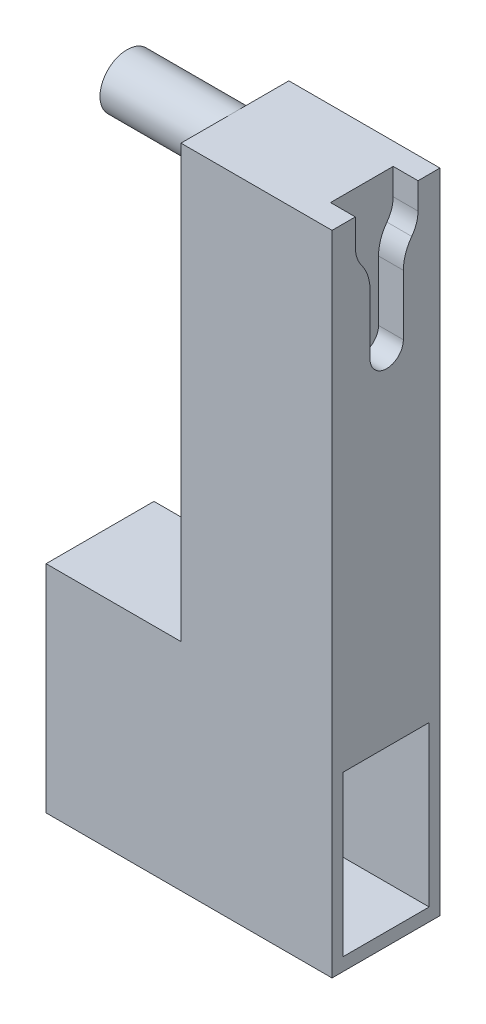
ISO-10303-21;
HEADER;
FILE_DESCRIPTION(('STEP AP214'),'2;1');
FILE_NAME('part.step','',(''),(''),'','','');
FILE_SCHEMA(('AUTOMOTIVE_DESIGN { 1 0 10303 214 1 1 1 1 }'));
ENDSEC;
DATA;
#1=APPLICATION_CONTEXT('core data for automotive mechanical design processes');
#2=APPLICATION_PROTOCOL_DEFINITION('international standard','automotive_design',2000,#1);
#3=PRODUCT_CONTEXT('',#1,'mechanical');
#4=PRODUCT('Part','Part','',(#3));
#5=PRODUCT_RELATED_PRODUCT_CATEGORY('part','',(#4));
#6=PRODUCT_DEFINITION_FORMATION('','',#4);
#7=PRODUCT_DEFINITION_CONTEXT('part definition',#1,'design');
#8=PRODUCT_DEFINITION('design','',#6,#7);
#9=PRODUCT_DEFINITION_SHAPE('','',#8);
#10=(LENGTH_UNIT() NAMED_UNIT(*) SI_UNIT(.MILLI.,.METRE.));
#11=(NAMED_UNIT(*) PLANE_ANGLE_UNIT() SI_UNIT($,.RADIAN.));
#12=(NAMED_UNIT(*) SI_UNIT($,.STERADIAN.) SOLID_ANGLE_UNIT());
#13=UNCERTAINTY_MEASURE_WITH_UNIT(LENGTH_MEASURE(1.E-05),#10,'distance_accuracy_value','');
#14=(GEOMETRIC_REPRESENTATION_CONTEXT(3) GLOBAL_UNCERTAINTY_ASSIGNED_CONTEXT((#13)) GLOBAL_UNIT_ASSIGNED_CONTEXT((#10,
#11,#12)) REPRESENTATION_CONTEXT('',''));
#15=CARTESIAN_POINT('',(0.,0.,0.));
#16=DIRECTION('',(0.,0.,1.));
#17=DIRECTION('',(1.,0.,0.));
#18=AXIS2_PLACEMENT_3D('',#15,#16,#17);
#19=CARTESIAN_POINT('',(-17.78,25.4,12.7));
#20=DIRECTION('',(1.,0.,0.));
#21=DIRECTION('',(0.,0.,-1.));
#22=AXIS2_PLACEMENT_3D('',#19,#20,#21);
#23=PLANE('',#22);
#24=DIRECTION('',(0.,0.,-1.));
#25=VECTOR('',#24,1.);
#26=CARTESIAN_POINT('',(-17.78,-76.2,-12.7));
#27=LINE('',#26,#25);
#28=CARTESIAN_POINT('',(-17.78,-76.2,12.7));
#29=VERTEX_POINT('',#28);
#30=CARTESIAN_POINT('',(-17.78,-76.2,-12.7));
#31=VERTEX_POINT('',#30);
#32=EDGE_CURVE('E217',#29,#31,#27,.T.);
#33=ORIENTED_EDGE('',*,*,#32,.F.);
#34=DIRECTION('',(0.,-1.,0.));
#35=VECTOR('',#34,1.);
#36=CARTESIAN_POINT('',(-17.78,25.4,12.7));
#37=LINE('',#36,#35);
#38=CARTESIAN_POINT('',(-17.78,25.4,12.7));
#39=VERTEX_POINT('',#38);
#40=EDGE_CURVE('E337',#39,#29,#37,.T.);
#41=ORIENTED_EDGE('',*,*,#40,.F.);
#42=DIRECTION('',(0.,0.,1.));
#43=VECTOR('',#42,1.);
#44=CARTESIAN_POINT('',(-17.78,25.4,12.7));
#45=LINE('',#44,#43);
#46=CARTESIAN_POINT('',(-17.78,25.4,0.));
#47=VERTEX_POINT('',#46);
#48=EDGE_CURVE('E330',#47,#39,#45,.T.);
#49=ORIENTED_EDGE('',*,*,#48,.F.);
#50=CARTESIAN_POINT('',(-17.78,19.05,0.));
#51=DIRECTION('',(1.,0.,0.));
#52=DIRECTION('',(0.,0.,-1.));
#53=AXIS2_PLACEMENT_3D('',#50,#51,#52);
#54=CIRCLE('',#53,6.35);
#55=EDGE_CURVE('E321',#47,#47,#54,.F.);
#56=ORIENTED_EDGE('',*,*,#55,.F.);
#57=CARTESIAN_POINT('',(-17.78,25.4,-12.7));
#58=VERTEX_POINT('',#57);
#59=EDGE_CURVE('E331',#58,#47,#45,.T.);
#60=ORIENTED_EDGE('',*,*,#59,.F.);
#61=DIRECTION('',(0.,-1.,0.));
#62=VECTOR('',#61,1.);
#63=CARTESIAN_POINT('',(-17.78,25.4,-12.7));
#64=LINE('',#63,#62);
#65=EDGE_CURVE('E340',#58,#31,#64,.T.);
#66=ORIENTED_EDGE('',*,*,#65,.T.);
#67=EDGE_LOOP('',(#33,#41,#49,#56,#60,#66));
#68=FACE_BOUND('',#67,.T.);
#69=ADVANCED_FACE('F43',(#68),#23,.F.);
#70=CARTESIAN_POINT('',(17.78,25.4,12.7));
#71=DIRECTION('',(-1.,0.,0.));
#72=DIRECTION('',(0.,0.,1.));
#73=AXIS2_PLACEMENT_3D('',#70,#71,#72);
#74=PLANE('',#73);
#75=DIRECTION('',(0.,1.,0.));
#76=VECTOR('',#75,1.);
#77=CARTESIAN_POINT('',(17.78,0.,-10.1599999999999));
#78=LINE('',#77,#76);
#79=CARTESIAN_POINT('',(17.78,-123.952,-10.1599999999999));
#80=VERTEX_POINT('',#79);
#81=CARTESIAN_POINT('',(17.78,-86.36,-10.1599999999999));
#82=VERTEX_POINT('',#81);
#83=EDGE_CURVE('E211',#80,#82,#78,.T.);
#84=ORIENTED_EDGE('',*,*,#83,.F.);
#85=DIRECTION('',(0.,0.,-1.));
#86=VECTOR('',#85,1.);
#87=CARTESIAN_POINT('',(17.78,-123.952,0.));
#88=LINE('',#87,#86);
#89=CARTESIAN_POINT('',(17.78,-123.952,10.1599999999999));
#90=VERTEX_POINT('',#89);
#91=EDGE_CURVE('E58',#90,#80,#88,.T.);
#92=ORIENTED_EDGE('',*,*,#91,.F.);
#93=DIRECTION('',(0.,1.,0.));
#94=VECTOR('',#93,1.);
#95=CARTESIAN_POINT('',(17.78,0.,10.1599999999999));
#96=LINE('',#95,#94);
#97=CARTESIAN_POINT('',(17.78,-86.36,10.1599999999999));
#98=VERTEX_POINT('',#97);
#99=EDGE_CURVE('E202',#90,#98,#96,.T.);
#100=ORIENTED_EDGE('',*,*,#99,.T.);
#101=DIRECTION('',(0.,0.,-1.));
#102=VECTOR('',#101,1.);
#103=CARTESIAN_POINT('',(17.78,-86.36,0.));
#104=LINE('',#103,#102);
#105=EDGE_CURVE('E205',#98,#82,#104,.T.);
#106=ORIENTED_EDGE('',*,*,#105,.T.);
#107=EDGE_LOOP('',(#84,#92,#100,#106));
#108=FACE_BOUND('',#107,.T.);
#109=DIRECTION('',(0.,1.,0.));
#110=VECTOR('',#109,1.);
#111=CARTESIAN_POINT('',(17.78,0.,7.21700000000007));
#112=LINE('',#111,#110);
#113=CARTESIAN_POINT('',(17.78,19.21,7.21700000000007));
#114=VERTEX_POINT('',#113);
#115=CARTESIAN_POINT('',(17.78,25.4,7.21700000000007));
#116=VERTEX_POINT('',#115);
#117=EDGE_CURVE('E288',#114,#116,#112,.T.);
#118=ORIENTED_EDGE('',*,*,#117,.T.);
#119=DIRECTION('',(0.,0.,-1.));
#120=VECTOR('',#119,1.);
#121=CARTESIAN_POINT('',(17.78,25.4,12.7));
#122=LINE('',#121,#120);
#123=CARTESIAN_POINT('',(17.78,25.4,12.7));
#124=VERTEX_POINT('',#123);
#125=EDGE_CURVE('E325',#124,#116,#122,.T.);
#126=ORIENTED_EDGE('',*,*,#125,.F.);
#127=DIRECTION('',(0.,-1.,0.));
#128=VECTOR('',#127,1.);
#129=CARTESIAN_POINT('',(17.78,25.4,12.7));
#130=LINE('',#129,#128);
#131=CARTESIAN_POINT('',(17.78,-127.,12.7));
#132=VERTEX_POINT('',#131);
#133=EDGE_CURVE('E335',#124,#132,#130,.T.);
#134=ORIENTED_EDGE('',*,*,#133,.T.);
#135=DIRECTION('',(0.,0.,1.));
#136=VECTOR('',#135,1.);
#137=CARTESIAN_POINT('',(17.78,-127.,12.7));
#138=LINE('',#137,#136);
#139=CARTESIAN_POINT('',(17.78,-127.,-12.7));
#140=VERTEX_POINT('',#139);
#141=EDGE_CURVE('E252',#140,#132,#138,.T.);
#142=ORIENTED_EDGE('',*,*,#141,.F.);
#143=DIRECTION('',(0.,-1.,0.));
#144=VECTOR('',#143,1.);
#145=CARTESIAN_POINT('',(17.78,25.4,-12.7));
#146=LINE('',#145,#144);
#147=CARTESIAN_POINT('',(17.78,25.4,-12.7));
#148=VERTEX_POINT('',#147);
#149=EDGE_CURVE('E343',#148,#140,#146,.T.);
#150=ORIENTED_EDGE('',*,*,#149,.F.);
#151=CARTESIAN_POINT('',(17.78,25.4,-7.53699999999994));
#152=VERTEX_POINT('',#151);
#153=EDGE_CURVE('E324',#152,#148,#122,.T.);
#154=ORIENTED_EDGE('',*,*,#153,.F.);
#155=DIRECTION('',(0.,1.,0.));
#156=VECTOR('',#155,1.);
#157=CARTESIAN_POINT('',(17.78,0.,-7.53699999999994));
#158=LINE('',#157,#156);
#159=CARTESIAN_POINT('',(17.78,19.21,-7.53699999999994));
#160=VERTEX_POINT('',#159);
#161=EDGE_CURVE('E285',#160,#152,#158,.T.);
#162=ORIENTED_EDGE('',*,*,#161,.F.);
#163=CARTESIAN_POINT('',(17.78,19.21,-0.159999999999939));
#164=DIRECTION('',(1.,0.,0.));
#165=DIRECTION('',(0.,0.,-1.));
#166=AXIS2_PLACEMENT_3D('',#163,#164,#165);
#167=CIRCLE('',#166,7.37700000000001);
#168=CARTESIAN_POINT('',(17.78,14.7837999999999,-6.06159999999994));
#169=VERTEX_POINT('',#168);
#170=EDGE_CURVE('E282',#169,#160,#167,.T.);
#171=ORIENTED_EDGE('',*,*,#170,.F.);
#172=CARTESIAN_POINT('',(17.78,8.85999999999995,-13.9599999999999));
#173=DIRECTION('',(1.,0.,0.));
#174=DIRECTION('',(0.,0.,-1.));
#175=AXIS2_PLACEMENT_3D('',#172,#173,#174);
#176=CIRCLE('',#175,9.873);
#177=CARTESIAN_POINT('',(17.78,8.85999999999995,-4.08699999999994));
#178=VERTEX_POINT('',#177);
#179=EDGE_CURVE('E257',#169,#178,#176,.T.);
#180=ORIENTED_EDGE('',*,*,#179,.T.);
#181=DIRECTION('',(0.,-1.,0.));
#182=VECTOR('',#181,1.);
#183=CARTESIAN_POINT('',(17.78,0.,-4.08699999999993));
#184=LINE('',#183,#182);
#185=CARTESIAN_POINT('',(17.78,-5.29000000000006,-4.08699999999993));
#186=VERTEX_POINT('',#185);
#187=EDGE_CURVE('E262',#178,#186,#184,.T.);
#188=ORIENTED_EDGE('',*,*,#187,.T.);
#189=CARTESIAN_POINT('',(17.78,-5.29000000000006,-0.159999999999936));
#190=DIRECTION('',(1.,0.,0.));
#191=DIRECTION('',(0.,0.,-1.));
#192=AXIS2_PLACEMENT_3D('',#189,#190,#191);
#193=CIRCLE('',#192,3.927);
#194=CARTESIAN_POINT('',(17.78,-5.29000000000006,3.76700000000006));
#195=VERTEX_POINT('',#194);
#196=EDGE_CURVE('E297',#195,#186,#193,.T.);
#197=ORIENTED_EDGE('',*,*,#196,.F.);
#198=DIRECTION('',(0.,-1.,0.));
#199=VECTOR('',#198,1.);
#200=CARTESIAN_POINT('',(17.78,0.,3.76700000000006));
#201=LINE('',#200,#199);
#202=CARTESIAN_POINT('',(17.78,8.85999999999995,3.76700000000006));
#203=VERTEX_POINT('',#202);
#204=EDGE_CURVE('E294',#203,#195,#201,.T.);
#205=ORIENTED_EDGE('',*,*,#204,.F.);
#206=CARTESIAN_POINT('',(17.78,8.85999999999995,13.6400000000001));
#207=DIRECTION('',(1.,0.,0.));
#208=DIRECTION('',(0.,0.,-1.));
#209=AXIS2_PLACEMENT_3D('',#206,#207,#208);
#210=CIRCLE('',#209,9.873);
#211=CARTESIAN_POINT('',(17.78,14.7837999999999,5.74160000000007));
#212=VERTEX_POINT('',#211);
#213=EDGE_CURVE('E291',#203,#212,#210,.T.);
#214=ORIENTED_EDGE('',*,*,#213,.T.);
#215=EDGE_CURVE('E286',#114,#212,#167,.T.);
#216=ORIENTED_EDGE('',*,*,#215,.F.);
#217=EDGE_LOOP('',(#118,#126,#134,#142,#150,#154,#162,#171,#180,#188,#197,#205,#214,#216));
#218=FACE_BOUND('',#217,.T.);
#219=ADVANCED_FACE('F45',(#108,#218),#74,.F.);
#220=CARTESIAN_POINT('',(0.,25.4,0.));
#221=DIRECTION('',(0.,-1.,0.));
#222=DIRECTION('',(0.,0.,-1.));
#223=AXIS2_PLACEMENT_3D('',#220,#221,#222);
#224=PLANE('',#223);
#225=DIRECTION('',(1.,0.,0.));
#226=VECTOR('',#225,1.);
#227=CARTESIAN_POINT('',(0.,25.4,7.21700000000007));
#228=LINE('',#227,#226);
#229=CARTESIAN_POINT('',(11.938,25.4,7.21700000000007));
#230=VERTEX_POINT('',#229);
#231=EDGE_CURVE('E11',#230,#116,#228,.T.);
#232=ORIENTED_EDGE('',*,*,#231,.F.);
#233=DIRECTION('',(0.,0.,1.));
#234=VECTOR('',#233,1.);
#235=CARTESIAN_POINT('',(11.938,25.4,0.));
#236=LINE('',#235,#234);
#237=CARTESIAN_POINT('',(11.938,25.4,-7.53699999999994));
#238=VERTEX_POINT('',#237);
#239=EDGE_CURVE('E345',#238,#230,#236,.T.);
#240=ORIENTED_EDGE('',*,*,#239,.F.);
#241=DIRECTION('',(1.,0.,0.));
#242=VECTOR('',#241,1.);
#243=CARTESIAN_POINT('',(0.,25.4,-7.53699999999994));
#244=LINE('',#243,#242);
#245=EDGE_CURVE('E51',#238,#152,#244,.T.);
#246=ORIENTED_EDGE('',*,*,#245,.T.);
#247=ORIENTED_EDGE('',*,*,#153,.T.);
#248=DIRECTION('',(-1.,0.,0.));
#249=VECTOR('',#248,1.);
#250=CARTESIAN_POINT('',(-17.78,25.4,-12.7));
#251=LINE('',#250,#249);
#252=EDGE_CURVE('E328',#148,#58,#251,.T.);
#253=ORIENTED_EDGE('',*,*,#252,.T.);
#254=ORIENTED_EDGE('',*,*,#59,.T.);
#255=ORIENTED_EDGE('',*,*,#48,.T.);
#256=DIRECTION('',(1.,0.,0.));
#257=VECTOR('',#256,1.);
#258=CARTESIAN_POINT('',(-17.78,25.4,12.7));
#259=LINE('',#258,#257);
#260=EDGE_CURVE('E333',#39,#124,#259,.T.);
#261=ORIENTED_EDGE('',*,*,#260,.T.);
#262=ORIENTED_EDGE('',*,*,#125,.T.);
#263=EDGE_LOOP('',(#232,#240,#246,#247,#253,#254,#255,#261,#262));
#264=FACE_BOUND('',#263,.T.);
#265=ADVANCED_FACE('F351',(#264),#224,.F.);
#266=CARTESIAN_POINT('',(-17.78,25.4,-12.7));
#267=DIRECTION('',(0.,0.,1.));
#268=DIRECTION('',(1.,0.,0.));
#269=AXIS2_PLACEMENT_3D('',#266,#267,#268);
#270=PLANE('',#269);
#271=ORIENTED_EDGE('',*,*,#149,.T.);
#272=DIRECTION('',(1.,0.,0.));
#273=VECTOR('',#272,1.);
#274=CARTESIAN_POINT('',(-17.78,-127.,-12.7));
#275=LINE('',#274,#273);
#276=CARTESIAN_POINT('',(-49.53,-127.,-12.7));
#277=VERTEX_POINT('',#276);
#278=EDGE_CURVE('E249',#277,#140,#275,.T.);
#279=ORIENTED_EDGE('',*,*,#278,.F.);
#280=DIRECTION('',(0.,-1.,0.));
#281=VECTOR('',#280,1.);
#282=CARTESIAN_POINT('',(-49.53,-127.,-12.7));
#283=LINE('',#282,#281);
#284=CARTESIAN_POINT('',(-49.53,-76.2,-12.7));
#285=VERTEX_POINT('',#284);
#286=EDGE_CURVE('E221',#285,#277,#283,.T.);
#287=ORIENTED_EDGE('',*,*,#286,.F.);
#288=DIRECTION('',(1.,0.,0.));
#289=VECTOR('',#288,1.);
#290=CARTESIAN_POINT('',(-49.53,-76.2,-12.7));
#291=LINE('',#290,#289);
#292=EDGE_CURVE('E231',#285,#31,#291,.T.);
#293=ORIENTED_EDGE('',*,*,#292,.T.);
#294=ORIENTED_EDGE('',*,*,#65,.F.);
#295=ORIENTED_EDGE('',*,*,#252,.F.);
#296=EDGE_LOOP('',(#271,#279,#287,#293,#294,#295));
#297=FACE_BOUND('',#296,.T.);
#298=ADVANCED_FACE('F360',(#297),#270,.F.);
#299=CARTESIAN_POINT('',(-17.78,25.4,12.7));
#300=DIRECTION('',(0.,0.,-1.));
#301=DIRECTION('',(-1.,0.,0.));
#302=AXIS2_PLACEMENT_3D('',#299,#300,#301);
#303=PLANE('',#302);
#304=ORIENTED_EDGE('',*,*,#40,.T.);
#305=DIRECTION('',(1.,0.,0.));
#306=VECTOR('',#305,1.);
#307=CARTESIAN_POINT('',(-49.53,-76.2,12.7));
#308=LINE('',#307,#306);
#309=CARTESIAN_POINT('',(-49.53,-76.2,12.7));
#310=VERTEX_POINT('',#309);
#311=EDGE_CURVE('E235',#310,#29,#308,.T.);
#312=ORIENTED_EDGE('',*,*,#311,.F.);
#313=DIRECTION('',(0.,1.,0.));
#314=VECTOR('',#313,1.);
#315=CARTESIAN_POINT('',(-49.53,-127.,12.7));
#316=LINE('',#315,#314);
#317=CARTESIAN_POINT('',(-49.53,-127.,12.7));
#318=VERTEX_POINT('',#317);
#319=EDGE_CURVE('E227',#318,#310,#316,.T.);
#320=ORIENTED_EDGE('',*,*,#319,.F.);
#321=DIRECTION('',(-1.,0.,0.));
#322=VECTOR('',#321,1.);
#323=CARTESIAN_POINT('',(-17.78,-127.,12.7));
#324=LINE('',#323,#322);
#325=EDGE_CURVE('E255',#132,#318,#324,.T.);
#326=ORIENTED_EDGE('',*,*,#325,.F.);
#327=ORIENTED_EDGE('',*,*,#133,.F.);
#328=ORIENTED_EDGE('',*,*,#260,.F.);
#329=EDGE_LOOP('',(#304,#312,#320,#326,#327,#328));
#330=FACE_BOUND('',#329,.T.);
#331=ADVANCED_FACE('F383',(#330),#303,.F.);
#332=CARTESIAN_POINT('',(-43.18,19.05,0.));
#333=DIRECTION('',(1.,0.,0.));
#334=DIRECTION('',(0.,0.,-1.));
#335=AXIS2_PLACEMENT_3D('',#332,#333,#334);
#336=CYLINDRICAL_SURFACE('',#335,6.35);
#337=CARTESIAN_POINT('',(-43.18,19.05,0.));
#338=DIRECTION('',(-1.,0.,0.));
#339=DIRECTION('',(0.,0.,1.));
#340=AXIS2_PLACEMENT_3D('',#337,#338,#339);
#341=CIRCLE('',#340,6.35);
#342=CARTESIAN_POINT('',(-43.18,19.05,6.35));
#343=VERTEX_POINT('',#342);
#344=EDGE_CURVE('E305',#343,#343,#341,.T.);
#345=ORIENTED_EDGE('',*,*,#344,.F.);
#346=EDGE_LOOP('',(#345));
#347=FACE_BOUND('',#346,.T.);
#348=ORIENTED_EDGE('',*,*,#55,.T.);
#349=EDGE_LOOP('',(#348));
#350=FACE_BOUND('',#349,.T.);
#351=ADVANCED_FACE('F445',(#347,#350),#336,.T.);
#352=CARTESIAN_POINT('',(-43.18,19.05,0.));
#353=DIRECTION('',(-1.,0.,0.));
#354=DIRECTION('',(0.,0.,1.));
#355=AXIS2_PLACEMENT_3D('',#352,#353,#354);
#356=PLANE('',#355);
#357=ORIENTED_EDGE('',*,*,#344,.T.);
#358=EDGE_LOOP('',(#357));
#359=FACE_BOUND('',#358,.T.);
#360=ADVANCED_FACE('F429',(#359),#356,.T.);
#361=CARTESIAN_POINT('',(11.938,0.,7.21700000000007));
#362=DIRECTION('',(0.,0.,-1.));
#363=DIRECTION('',(-1.,0.,0.));
#364=AXIS2_PLACEMENT_3D('',#361,#362,#363);
#365=PLANE('',#364);
#366=ORIENTED_EDGE('',*,*,#231,.T.);
#367=ORIENTED_EDGE('',*,*,#117,.F.);
#368=DIRECTION('',(1.,0.,0.));
#369=VECTOR('',#368,1.);
#370=CARTESIAN_POINT('',(11.938,19.21,7.21700000000007));
#371=LINE('',#370,#369);
#372=CARTESIAN_POINT('',(11.938,19.21,7.21700000000007));
#373=VERTEX_POINT('',#372);
#374=EDGE_CURVE('E314',#373,#114,#371,.T.);
#375=ORIENTED_EDGE('',*,*,#374,.F.);
#376=DIRECTION('',(0.,1.,0.));
#377=VECTOR('',#376,1.);
#378=CARTESIAN_POINT('',(11.938,0.,7.21700000000007));
#379=LINE('',#378,#377);
#380=EDGE_CURVE('E266',#373,#230,#379,.T.);
#381=ORIENTED_EDGE('',*,*,#380,.T.);
#382=EDGE_LOOP('',(#366,#367,#375,#381));
#383=FACE_BOUND('',#382,.T.);
#384=ADVANCED_FACE('F389',(#383),#365,.T.);
#385=CARTESIAN_POINT('',(11.938,0.,-7.53699999999994));
#386=DIRECTION('',(0.,0.,-1.));
#387=DIRECTION('',(-1.,0.,0.));
#388=AXIS2_PLACEMENT_3D('',#385,#386,#387);
#389=PLANE('',#388);
#390=DIRECTION('',(0.,1.,0.));
#391=VECTOR('',#390,1.);
#392=CARTESIAN_POINT('',(11.938,0.,-7.53699999999994));
#393=LINE('',#392,#391);
#394=CARTESIAN_POINT('',(11.938,19.21,-7.53699999999994));
#395=VERTEX_POINT('',#394);
#396=EDGE_CURVE('E66',#395,#238,#393,.T.);
#397=ORIENTED_EDGE('',*,*,#396,.F.);
#398=DIRECTION('',(1.,0.,0.));
#399=VECTOR('',#398,1.);
#400=CARTESIAN_POINT('',(11.938,19.21,-7.53699999999994));
#401=LINE('',#400,#399);
#402=EDGE_CURVE('E316',#395,#160,#401,.T.);
#403=ORIENTED_EDGE('',*,*,#402,.T.);
#404=ORIENTED_EDGE('',*,*,#161,.T.);
#405=ORIENTED_EDGE('',*,*,#245,.F.);
#406=EDGE_LOOP('',(#397,#403,#404,#405));
#407=FACE_BOUND('',#406,.T.);
#408=ADVANCED_FACE('F420',(#407),#389,.F.);
#409=CARTESIAN_POINT('',(11.938,0.,0.));
#410=DIRECTION('',(1.,0.,0.));
#411=DIRECTION('',(0.,0.,-1.));
#412=AXIS2_PLACEMENT_3D('',#409,#410,#411);
#413=PLANE('',#412);
#414=CARTESIAN_POINT('',(11.938,-1.29000000000006,-0.15999999999994));
#415=DIRECTION('',(1.,0.,0.));
#416=DIRECTION('',(0.,0.,-1.));
#417=AXIS2_PLACEMENT_3D('',#414,#415,#416);
#418=CIRCLE('',#417,1.3953589838486);
#419=CARTESIAN_POINT('',(11.938,-1.29000000000006,1.23535898384866));
#420=VERTEX_POINT('',#419);
#421=EDGE_CURVE('E246',#420,#420,#418,.F.);
#422=ORIENTED_EDGE('',*,*,#421,.T.);
#423=EDGE_LOOP('',(#422));
#424=FACE_BOUND('',#423,.T.);
#425=CARTESIAN_POINT('',(11.938,-5.29000000000006,-0.159999999999936));
#426=DIRECTION('',(1.,0.,0.));
#427=DIRECTION('',(0.,0.,-1.));
#428=AXIS2_PLACEMENT_3D('',#425,#426,#427);
#429=CIRCLE('',#428,1.39535898384865);
#430=CARTESIAN_POINT('',(11.938,-5.29000000000006,1.23535898384872));
#431=VERTEX_POINT('',#430);
#432=EDGE_CURVE('E241',#431,#431,#429,.F.);
#433=ORIENTED_EDGE('',*,*,#432,.T.);
#434=EDGE_LOOP('',(#433));
#435=FACE_BOUND('',#434,.T.);
#436=ORIENTED_EDGE('',*,*,#239,.T.);
#437=ORIENTED_EDGE('',*,*,#380,.F.);
#438=CARTESIAN_POINT('',(11.938,19.21,-0.159999999999939));
#439=DIRECTION('',(1.,0.,0.));
#440=DIRECTION('',(0.,0.,-1.));
#441=AXIS2_PLACEMENT_3D('',#438,#439,#440);
#442=CIRCLE('',#441,7.37700000000001);
#443=CARTESIAN_POINT('',(11.938,14.7837999999999,5.74160000000007));
#444=VERTEX_POINT('',#443);
#445=EDGE_CURVE('E264',#373,#444,#442,.T.);
#446=ORIENTED_EDGE('',*,*,#445,.T.);
#447=CARTESIAN_POINT('',(11.938,8.85999999999995,13.6400000000001));
#448=DIRECTION('',(1.,0.,0.));
#449=DIRECTION('',(0.,0.,-1.));
#450=AXIS2_PLACEMENT_3D('',#447,#448,#449);
#451=CIRCLE('',#450,9.873);
#452=CARTESIAN_POINT('',(11.938,8.85999999999995,3.76700000000006));
#453=VERTEX_POINT('',#452);
#454=EDGE_CURVE('E269',#453,#444,#451,.T.);
#455=ORIENTED_EDGE('',*,*,#454,.F.);
#456=DIRECTION('',(0.,-1.,0.));
#457=VECTOR('',#456,1.);
#458=CARTESIAN_POINT('',(11.938,0.,3.76700000000006));
#459=LINE('',#458,#457);
#460=CARTESIAN_POINT('',(11.938,-5.29000000000006,3.76700000000006));
#461=VERTEX_POINT('',#460);
#462=EDGE_CURVE('E271',#453,#461,#459,.T.);
#463=ORIENTED_EDGE('',*,*,#462,.T.);
#464=CARTESIAN_POINT('',(11.938,-5.29000000000006,-0.159999999999936));
#465=DIRECTION('',(1.,0.,0.));
#466=DIRECTION('',(0.,0.,-1.));
#467=AXIS2_PLACEMENT_3D('',#464,#465,#466);
#468=CIRCLE('',#467,3.927);
#469=CARTESIAN_POINT('',(11.938,-5.29000000000006,-4.08699999999993));
#470=VERTEX_POINT('',#469);
#471=EDGE_CURVE('E274',#461,#470,#468,.T.);
#472=ORIENTED_EDGE('',*,*,#471,.T.);
#473=DIRECTION('',(0.,-1.,0.));
#474=VECTOR('',#473,1.);
#475=CARTESIAN_POINT('',(11.938,0.,-4.08699999999993));
#476=LINE('',#475,#474);
#477=CARTESIAN_POINT('',(11.938,8.85999999999995,-4.08699999999994));
#478=VERTEX_POINT('',#477);
#479=EDGE_CURVE('E277',#478,#470,#476,.T.);
#480=ORIENTED_EDGE('',*,*,#479,.F.);
#481=CARTESIAN_POINT('',(11.938,8.85999999999995,-13.9599999999999));
#482=DIRECTION('',(1.,0.,0.));
#483=DIRECTION('',(0.,0.,-1.));
#484=AXIS2_PLACEMENT_3D('',#481,#482,#483);
#485=CIRCLE('',#484,9.873);
#486=CARTESIAN_POINT('',(11.938,14.7837999999999,-6.06159999999994));
#487=VERTEX_POINT('',#486);
#488=EDGE_CURVE('E258',#487,#478,#485,.T.);
#489=ORIENTED_EDGE('',*,*,#488,.F.);
#490=EDGE_CURVE('E261',#487,#395,#442,.T.);
#491=ORIENTED_EDGE('',*,*,#490,.T.);
#492=ORIENTED_EDGE('',*,*,#396,.T.);
#493=EDGE_LOOP('',(#436,#437,#446,#455,#463,#472,#480,#489,#491,#492));
#494=FACE_BOUND('',#493,.T.);
#495=ADVANCED_FACE('F393',(#424,#435,#494),#413,.T.);
#496=CARTESIAN_POINT('',(11.938,8.85999999999995,-13.9599999999999));
#497=DIRECTION('',(1.,0.,0.));
#498=DIRECTION('',(0.,0.,-1.));
#499=AXIS2_PLACEMENT_3D('',#496,#497,#498);
#500=CYLINDRICAL_SURFACE('',#499,9.873);
#501=ORIENTED_EDGE('',*,*,#179,.F.);
#502=DIRECTION('',(1.,0.,0.));
#503=VECTOR('',#502,1.);
#504=CARTESIAN_POINT('',(11.938,14.7837999999999,-6.06159999999994));
#505=LINE('',#504,#503);
#506=EDGE_CURVE('E279',#487,#169,#505,.T.);
#507=ORIENTED_EDGE('',*,*,#506,.F.);
#508=ORIENTED_EDGE('',*,*,#488,.T.);
#509=DIRECTION('',(1.,0.,0.));
#510=VECTOR('',#509,1.);
#511=CARTESIAN_POINT('',(11.938,8.85999999999995,-4.08699999999994));
#512=LINE('',#511,#510);
#513=EDGE_CURVE('E302',#478,#178,#512,.T.);
#514=ORIENTED_EDGE('',*,*,#513,.T.);
#515=EDGE_LOOP('',(#501,#507,#508,#514));
#516=FACE_BOUND('',#515,.T.);
#517=ADVANCED_FACE('F416',(#516),#500,.T.);
#518=CARTESIAN_POINT('',(11.938,0.,-4.08699999999993));
#519=DIRECTION('',(0.,0.,1.));
#520=DIRECTION('',(0.,-1.,0.));
#521=AXIS2_PLACEMENT_3D('',#518,#519,#520);
#522=PLANE('',#521);
#523=ORIENTED_EDGE('',*,*,#187,.F.);
#524=ORIENTED_EDGE('',*,*,#513,.F.);
#525=ORIENTED_EDGE('',*,*,#479,.T.);
#526=DIRECTION('',(1.,0.,0.));
#527=VECTOR('',#526,1.);
#528=CARTESIAN_POINT('',(11.938,-5.29000000000006,-4.08699999999993));
#529=LINE('',#528,#527);
#530=EDGE_CURVE('E306',#470,#186,#529,.T.);
#531=ORIENTED_EDGE('',*,*,#530,.T.);
#532=EDGE_LOOP('',(#523,#524,#525,#531));
#533=FACE_BOUND('',#532,.T.);
#534=ADVANCED_FACE('F417',(#533),#522,.T.);
#535=CARTESIAN_POINT('',(11.938,-5.29000000000006,-0.159999999999936));
#536=DIRECTION('',(1.,0.,0.));
#537=DIRECTION('',(0.,0.,-1.));
#538=AXIS2_PLACEMENT_3D('',#535,#536,#537);
#539=CYLINDRICAL_SURFACE('',#538,3.927);
#540=ORIENTED_EDGE('',*,*,#196,.T.);
#541=ORIENTED_EDGE('',*,*,#530,.F.);
#542=ORIENTED_EDGE('',*,*,#471,.F.);
#543=DIRECTION('',(1.,0.,0.));
#544=VECTOR('',#543,1.);
#545=CARTESIAN_POINT('',(11.938,-5.29000000000006,3.76700000000006));
#546=LINE('',#545,#544);
#547=EDGE_CURVE('E308',#461,#195,#546,.T.);
#548=ORIENTED_EDGE('',*,*,#547,.T.);
#549=EDGE_LOOP('',(#540,#541,#542,#548));
#550=FACE_BOUND('',#549,.T.);
#551=ADVANCED_FACE('F409',(#550),#539,.F.);
#552=CARTESIAN_POINT('',(11.938,0.,3.76700000000006));
#553=DIRECTION('',(0.,0.,1.));
#554=DIRECTION('',(0.,-1.,0.));
#555=AXIS2_PLACEMENT_3D('',#552,#553,#554);
#556=PLANE('',#555);
#557=ORIENTED_EDGE('',*,*,#204,.T.);
#558=ORIENTED_EDGE('',*,*,#547,.F.);
#559=ORIENTED_EDGE('',*,*,#462,.F.);
#560=DIRECTION('',(1.,0.,0.));
#561=VECTOR('',#560,1.);
#562=CARTESIAN_POINT('',(11.938,8.85999999999995,3.76700000000006));
#563=LINE('',#562,#561);
#564=EDGE_CURVE('E310',#453,#203,#563,.T.);
#565=ORIENTED_EDGE('',*,*,#564,.T.);
#566=EDGE_LOOP('',(#557,#558,#559,#565));
#567=FACE_BOUND('',#566,.T.);
#568=ADVANCED_FACE('F404',(#567),#556,.F.);
#569=CARTESIAN_POINT('',(11.938,8.85999999999995,13.6400000000001));
#570=DIRECTION('',(1.,0.,0.));
#571=DIRECTION('',(0.,0.,-1.));
#572=AXIS2_PLACEMENT_3D('',#569,#570,#571);
#573=CYLINDRICAL_SURFACE('',#572,9.873);
#574=ORIENTED_EDGE('',*,*,#213,.F.);
#575=ORIENTED_EDGE('',*,*,#564,.F.);
#576=ORIENTED_EDGE('',*,*,#454,.T.);
#577=DIRECTION('',(1.,0.,0.));
#578=VECTOR('',#577,1.);
#579=CARTESIAN_POINT('',(11.938,14.7837999999999,5.74160000000007));
#580=LINE('',#579,#578);
#581=EDGE_CURVE('E312',#444,#212,#580,.T.);
#582=ORIENTED_EDGE('',*,*,#581,.T.);
#583=EDGE_LOOP('',(#574,#575,#576,#582));
#584=FACE_BOUND('',#583,.T.);
#585=ADVANCED_FACE('F400',(#584),#573,.T.);
#586=CARTESIAN_POINT('',(11.938,19.21,-0.159999999999939));
#587=DIRECTION('',(1.,0.,0.));
#588=DIRECTION('',(0.,0.,-1.));
#589=AXIS2_PLACEMENT_3D('',#586,#587,#588);
#590=CYLINDRICAL_SURFACE('',#589,7.37700000000001);
#591=ORIENTED_EDGE('',*,*,#215,.T.);
#592=ORIENTED_EDGE('',*,*,#581,.F.);
#593=ORIENTED_EDGE('',*,*,#445,.F.);
#594=ORIENTED_EDGE('',*,*,#374,.T.);
#595=EDGE_LOOP('',(#591,#592,#593,#594));
#596=FACE_BOUND('',#595,.T.);
#597=ADVANCED_FACE('F397',(#596),#590,.F.);
#598=ORIENTED_EDGE('',*,*,#170,.T.);
#599=ORIENTED_EDGE('',*,*,#402,.F.);
#600=ORIENTED_EDGE('',*,*,#490,.F.);
#601=ORIENTED_EDGE('',*,*,#506,.T.);
#602=EDGE_LOOP('',(#598,#599,#600,#601));
#603=FACE_BOUND('',#602,.T.);
#604=ADVANCED_FACE('F419',(#603),#590,.F.);
#605=CARTESIAN_POINT('',(0.,-127.,0.));
#606=DIRECTION('',(0.,-1.,0.));
#607=DIRECTION('',(0.,0.,-1.));
#608=AXIS2_PLACEMENT_3D('',#605,#606,#607);
#609=PLANE('',#608);
#610=ORIENTED_EDGE('',*,*,#325,.T.);
#611=DIRECTION('',(0.,0.,1.));
#612=VECTOR('',#611,1.);
#613=CARTESIAN_POINT('',(-49.53,-127.,-12.7));
#614=LINE('',#613,#612);
#615=EDGE_CURVE('E224',#277,#318,#614,.T.);
#616=ORIENTED_EDGE('',*,*,#615,.F.);
#617=ORIENTED_EDGE('',*,*,#278,.T.);
#618=ORIENTED_EDGE('',*,*,#141,.T.);
#619=EDGE_LOOP('',(#610,#616,#617,#618));
#620=FACE_BOUND('',#619,.T.);
#621=ADVANCED_FACE('F365',(#620),#609,.T.);
#622=CARTESIAN_POINT('',(17.780012,-5.29000000000006,-0.159999999999936));
#623=DIRECTION('',(-1.,0.,0.));
#624=DIRECTION('',(0.,0.,1.));
#625=AXIS2_PLACEMENT_3D('',#622,#623,#624);
#626=CYLINDRICAL_SURFACE('',#625,1.39535898384865);
#627=CARTESIAN_POINT('',(5.08,-5.29000000000006,-0.159999999999936));
#628=DIRECTION('',(1.,0.,0.));
#629=DIRECTION('',(0.,0.,-1.));
#630=AXIS2_PLACEMENT_3D('',#627,#628,#629);
#631=CIRCLE('',#630,1.39535898384865);
#632=CARTESIAN_POINT('',(5.08,-5.29000000000006,1.23535898384872));
#633=VERTEX_POINT('',#632);
#634=EDGE_CURVE('E237',#633,#633,#631,.T.);
#635=CARTESIAN_POINT('',(11.938,-5.29000000000006,1.23535898384872));
#636=CARTESIAN_POINT('',(11.8665625,-5.29000000000006,1.23535898384872));
#637=CARTESIAN_POINT('',(11.795125,-5.29000000000006,1.23535898384872));
#638=CARTESIAN_POINT('',(11.65225,-5.29000000000006,1.23535898384872));
#639=CARTESIAN_POINT('',(11.5808125,-5.29000000000006,1.23535898384872));
#640=CARTESIAN_POINT('',(11.4379375,-5.29000000000006,1.23535898384872));
#641=CARTESIAN_POINT('',(11.3665,-5.29000000000006,1.23535898384872));
#642=CARTESIAN_POINT('',(11.223625,-5.29000000000006,1.23535898384872));
#643=CARTESIAN_POINT('',(11.1521875,-5.29000000000006,1.23535898384872));
#644=CARTESIAN_POINT('',(11.0093125,-5.29000000000006,1.23535898384872));
#645=CARTESIAN_POINT('',(10.937875,-5.29000000000006,1.23535898384872));
#646=CARTESIAN_POINT('',(10.795,-5.29000000000006,1.23535898384872));
#647=CARTESIAN_POINT('',(10.7235625,-5.29000000000006,1.23535898384872));
#648=CARTESIAN_POINT('',(10.5806875,-5.29000000000006,1.23535898384872));
#649=CARTESIAN_POINT('',(10.50925,-5.29000000000006,1.23535898384872));
#650=CARTESIAN_POINT('',(10.366375,-5.29000000000006,1.23535898384872));
#651=CARTESIAN_POINT('',(10.2949375,-5.29000000000006,1.23535898384872));
#652=CARTESIAN_POINT('',(10.1520625,-5.29000000000006,1.23535898384872));
#653=CARTESIAN_POINT('',(10.080625,-5.29000000000006,1.23535898384872));
#654=CARTESIAN_POINT('',(9.93775,-5.29000000000006,1.23535898384872));
#655=CARTESIAN_POINT('',(9.8663125,-5.29000000000006,1.23535898384872));
#656=CARTESIAN_POINT('',(9.7234375,-5.29000000000006,1.23535898384872));
#657=CARTESIAN_POINT('',(9.652,-5.29000000000006,1.23535898384872));
#658=CARTESIAN_POINT('',(9.509125,-5.29000000000006,1.23535898384872));
#659=CARTESIAN_POINT('',(9.4376875,-5.29000000000006,1.23535898384872));
#660=CARTESIAN_POINT('',(9.2948125,-5.29000000000006,1.23535898384872));
#661=CARTESIAN_POINT('',(9.223375,-5.29000000000006,1.23535898384872));
#662=CARTESIAN_POINT('',(9.0805,-5.29000000000006,1.23535898384872));
#663=CARTESIAN_POINT('',(9.0090625,-5.29000000000006,1.23535898384872));
#664=CARTESIAN_POINT('',(8.8661875,-5.29000000000006,1.23535898384872));
#665=CARTESIAN_POINT('',(8.79475,-5.29000000000006,1.23535898384872));
#666=CARTESIAN_POINT('',(8.651875,-5.29000000000006,1.23535898384872));
#667=CARTESIAN_POINT('',(8.5804375,-5.29000000000006,1.23535898384872));
#668=CARTESIAN_POINT('',(8.4375625,-5.29000000000006,1.23535898384872));
#669=CARTESIAN_POINT('',(8.366125,-5.29000000000006,1.23535898384872));
#670=CARTESIAN_POINT('',(8.22325,-5.29000000000006,1.23535898384872));
#671=CARTESIAN_POINT('',(8.1518125,-5.29000000000006,1.23535898384872));
#672=CARTESIAN_POINT('',(8.00893749999999,-5.29000000000006,1.23535898384872));
#673=CARTESIAN_POINT('',(7.9375,-5.29000000000006,1.23535898384872));
#674=CARTESIAN_POINT('',(7.794625,-5.29000000000006,1.23535898384872));
#675=CARTESIAN_POINT('',(7.7231875,-5.29000000000006,1.23535898384872));
#676=CARTESIAN_POINT('',(7.5803125,-5.29000000000006,1.23535898384872));
#677=CARTESIAN_POINT('',(7.508875,-5.29000000000006,1.23535898384872));
#678=CARTESIAN_POINT('',(7.366,-5.29000000000006,1.23535898384872));
#679=CARTESIAN_POINT('',(7.2945625,-5.29000000000006,1.23535898384872));
#680=CARTESIAN_POINT('',(7.1516875,-5.29000000000006,1.23535898384872));
#681=CARTESIAN_POINT('',(7.08025,-5.29000000000006,1.23535898384872));
#682=CARTESIAN_POINT('',(6.937375,-5.29000000000006,1.23535898384872));
#683=CARTESIAN_POINT('',(6.8659375,-5.29000000000006,1.23535898384872));
#684=CARTESIAN_POINT('',(6.7230625,-5.29000000000006,1.23535898384872));
#685=CARTESIAN_POINT('',(6.651625,-5.29000000000006,1.23535898384872));
#686=CARTESIAN_POINT('',(6.50875,-5.29000000000006,1.23535898384872));
#687=CARTESIAN_POINT('',(6.4373125,-5.29000000000006,1.23535898384872));
#688=CARTESIAN_POINT('',(6.2944375,-5.29000000000006,1.23535898384872));
#689=CARTESIAN_POINT('',(6.223,-5.29000000000006,1.23535898384872));
#690=CARTESIAN_POINT('',(6.080125,-5.29000000000006,1.23535898384872));
#691=CARTESIAN_POINT('',(6.0086875,-5.29000000000006,1.23535898384872));
#692=CARTESIAN_POINT('',(5.8658125,-5.29000000000006,1.23535898384872));
#693=CARTESIAN_POINT('',(5.794375,-5.29000000000006,1.23535898384872));
#694=CARTESIAN_POINT('',(5.6515,-5.29000000000006,1.23535898384872));
#695=CARTESIAN_POINT('',(5.5800625,-5.29000000000006,1.23535898384872));
#696=CARTESIAN_POINT('',(5.4371875,-5.29000000000006,1.23535898384872));
#697=CARTESIAN_POINT('',(5.36575,-5.29000000000006,1.23535898384872));
#698=CARTESIAN_POINT('',(5.222875,-5.29000000000006,1.23535898384872));
#699=CARTESIAN_POINT('',(5.1514375,-5.29000000000006,1.23535898384872));
#700=CARTESIAN_POINT('',(5.08,-5.29000000000006,1.23535898384872));
#701=B_SPLINE_CURVE_WITH_KNOTS('',3,(#635,#636,#637,#638,#639,#640,#641,#642,#643,#644,#645,
#646,#647,#648,#649,#650,#651,#652,#653,#654,#655,#656,#657,#658,#659,#660,#661,#662,#663,#664,
#665,#666,#667,#668,#669,#670,#671,#672,#673,#674,#675,#676,#677,#678,#679,#680,#681,#682,#683,
#684,#685,#686,#687,#688,#689,#690,#691,#692,#693,#694,#695,#696,#697,#698,#699,#700),
.UNSPECIFIED.,.F.,.F.,(4,2,2,2,2,2,2,2,2,2,2,2,2,2,2,2,2,2,2,2,2,2,2,2,2,2,2,2,2,2,2,2,4),(0.,
0.214312500000001,0.428625000000002,0.642937500000001,0.85725,1.0715625,1.285875,1.5001875,
1.7145,1.9288125,2.143125,2.3574375,2.57175,2.7860625,3.000375,3.2146875,3.429,3.6433125,
3.857625,4.0719375,4.28625,4.5005625,4.714875,4.9291875,5.1435,5.3578125,5.572125,5.7864375,
6.00075,6.2150625,6.429375,6.6436875,6.858),.UNSPECIFIED.);
#702=EDGE_CURVE('BSEAM478',#431,#633,#701,.T.);
#703=ORIENTED_EDGE('',*,*,#432,.F.);
#704=ORIENTED_EDGE('',*,*,#634,.F.);
#705=ORIENTED_EDGE('',*,*,#702,.T.);
#706=ORIENTED_EDGE('',*,*,#702,.F.);
#707=EDGE_LOOP('',(#703,#705,#704,#706));
#708=FACE_BOUND('',#707,.T.);
#709=ADVANCED_FACE('F478',(#708),#626,.F.);
#710=CARTESIAN_POINT('',(5.08,0.,0.));
#711=DIRECTION('',(1.,0.,0.));
#712=DIRECTION('',(0.,0.,-1.));
#713=AXIS2_PLACEMENT_3D('',#710,#711,#712);
#714=PLANE('',#713);
#715=ORIENTED_EDGE('',*,*,#634,.T.);
#716=EDGE_LOOP('',(#715));
#717=FACE_BOUND('',#716,.T.);
#718=ADVANCED_FACE('F482',(#717),#714,.T.);
#719=CARTESIAN_POINT('',(17.780012,-1.29000000000006,-0.15999999999994));
#720=DIRECTION('',(-1.,0.,0.));
#721=DIRECTION('',(0.,0.,1.));
#722=AXIS2_PLACEMENT_3D('',#719,#720,#721);
#723=CYLINDRICAL_SURFACE('',#722,1.3953589838486);
#724=CARTESIAN_POINT('',(5.08,-1.29000000000006,-0.15999999999994));
#725=DIRECTION('',(1.,0.,0.));
#726=DIRECTION('',(0.,0.,-1.));
#727=AXIS2_PLACEMENT_3D('',#724,#725,#726);
#728=CIRCLE('',#727,1.3953589838486);
#729=CARTESIAN_POINT('',(5.08,-1.29000000000006,1.23535898384866));
#730=VERTEX_POINT('',#729);
#731=EDGE_CURVE('E238',#730,#730,#728,.T.);
#732=CARTESIAN_POINT('',(11.938,-1.29000000000006,1.23535898384866));
#733=CARTESIAN_POINT('',(11.8665625,-1.29000000000006,1.23535898384866));
#734=CARTESIAN_POINT('',(11.795125,-1.29000000000006,1.23535898384866));
#735=CARTESIAN_POINT('',(11.65225,-1.29000000000006,1.23535898384866));
#736=CARTESIAN_POINT('',(11.5808125,-1.29000000000006,1.23535898384866));
#737=CARTESIAN_POINT('',(11.4379375,-1.29000000000006,1.23535898384866));
#738=CARTESIAN_POINT('',(11.3665,-1.29000000000006,1.23535898384866));
#739=CARTESIAN_POINT('',(11.223625,-1.29000000000006,1.23535898384866));
#740=CARTESIAN_POINT('',(11.1521875,-1.29000000000006,1.23535898384866));
#741=CARTESIAN_POINT('',(11.0093125,-1.29000000000006,1.23535898384866));
#742=CARTESIAN_POINT('',(10.937875,-1.29000000000006,1.23535898384866));
#743=CARTESIAN_POINT('',(10.795,-1.29000000000006,1.23535898384866));
#744=CARTESIAN_POINT('',(10.7235625,-1.29000000000006,1.23535898384866));
#745=CARTESIAN_POINT('',(10.5806875,-1.29000000000006,1.23535898384866));
#746=CARTESIAN_POINT('',(10.50925,-1.29000000000006,1.23535898384866));
#747=CARTESIAN_POINT('',(10.366375,-1.29000000000006,1.23535898384866));
#748=CARTESIAN_POINT('',(10.2949375,-1.29000000000006,1.23535898384866));
#749=CARTESIAN_POINT('',(10.1520625,-1.29000000000006,1.23535898384866));
#750=CARTESIAN_POINT('',(10.080625,-1.29000000000006,1.23535898384866));
#751=CARTESIAN_POINT('',(9.93775,-1.29000000000006,1.23535898384866));
#752=CARTESIAN_POINT('',(9.8663125,-1.29000000000006,1.23535898384866));
#753=CARTESIAN_POINT('',(9.7234375,-1.29000000000006,1.23535898384866));
#754=CARTESIAN_POINT('',(9.652,-1.29000000000006,1.23535898384866));
#755=CARTESIAN_POINT('',(9.509125,-1.29000000000006,1.23535898384866));
#756=CARTESIAN_POINT('',(9.4376875,-1.29000000000006,1.23535898384866));
#757=CARTESIAN_POINT('',(9.2948125,-1.29000000000006,1.23535898384866));
#758=CARTESIAN_POINT('',(9.223375,-1.29000000000006,1.23535898384866));
#759=CARTESIAN_POINT('',(9.0805,-1.29000000000006,1.23535898384866));
#760=CARTESIAN_POINT('',(9.0090625,-1.29000000000006,1.23535898384866));
#761=CARTESIAN_POINT('',(8.8661875,-1.29000000000006,1.23535898384866));
#762=CARTESIAN_POINT('',(8.79475,-1.29000000000006,1.23535898384866));
#763=CARTESIAN_POINT('',(8.651875,-1.29000000000006,1.23535898384866));
#764=CARTESIAN_POINT('',(8.5804375,-1.29000000000006,1.23535898384866));
#765=CARTESIAN_POINT('',(8.4375625,-1.29000000000006,1.23535898384866));
#766=CARTESIAN_POINT('',(8.366125,-1.29000000000006,1.23535898384866));
#767=CARTESIAN_POINT('',(8.22325,-1.29000000000006,1.23535898384866));
#768=CARTESIAN_POINT('',(8.1518125,-1.29000000000006,1.23535898384866));
#769=CARTESIAN_POINT('',(8.00893749999999,-1.29000000000006,1.23535898384866));
#770=CARTESIAN_POINT('',(7.9375,-1.29000000000006,1.23535898384866));
#771=CARTESIAN_POINT('',(7.794625,-1.29000000000006,1.23535898384866));
#772=CARTESIAN_POINT('',(7.7231875,-1.29000000000006,1.23535898384866));
#773=CARTESIAN_POINT('',(7.5803125,-1.29000000000006,1.23535898384866));
#774=CARTESIAN_POINT('',(7.508875,-1.29000000000006,1.23535898384866));
#775=CARTESIAN_POINT('',(7.366,-1.29000000000006,1.23535898384866));
#776=CARTESIAN_POINT('',(7.2945625,-1.29000000000006,1.23535898384866));
#777=CARTESIAN_POINT('',(7.1516875,-1.29000000000006,1.23535898384866));
#778=CARTESIAN_POINT('',(7.08025,-1.29000000000006,1.23535898384866));
#779=CARTESIAN_POINT('',(6.937375,-1.29000000000006,1.23535898384866));
#780=CARTESIAN_POINT('',(6.8659375,-1.29000000000006,1.23535898384866));
#781=CARTESIAN_POINT('',(6.7230625,-1.29000000000006,1.23535898384866));
#782=CARTESIAN_POINT('',(6.651625,-1.29000000000006,1.23535898384866));
#783=CARTESIAN_POINT('',(6.50875,-1.29000000000006,1.23535898384866));
#784=CARTESIAN_POINT('',(6.4373125,-1.29000000000006,1.23535898384866));
#785=CARTESIAN_POINT('',(6.2944375,-1.29000000000006,1.23535898384866));
#786=CARTESIAN_POINT('',(6.223,-1.29000000000006,1.23535898384866));
#787=CARTESIAN_POINT('',(6.080125,-1.29000000000006,1.23535898384866));
#788=CARTESIAN_POINT('',(6.0086875,-1.29000000000006,1.23535898384866));
#789=CARTESIAN_POINT('',(5.8658125,-1.29000000000006,1.23535898384866));
#790=CARTESIAN_POINT('',(5.794375,-1.29000000000006,1.23535898384866));
#791=CARTESIAN_POINT('',(5.6515,-1.29000000000006,1.23535898384866));
#792=CARTESIAN_POINT('',(5.5800625,-1.29000000000006,1.23535898384866));
#793=CARTESIAN_POINT('',(5.4371875,-1.29000000000006,1.23535898384866));
#794=CARTESIAN_POINT('',(5.36575,-1.29000000000006,1.23535898384866));
#795=CARTESIAN_POINT('',(5.222875,-1.29000000000006,1.23535898384866));
#796=CARTESIAN_POINT('',(5.1514375,-1.29000000000006,1.23535898384866));
#797=CARTESIAN_POINT('',(5.08,-1.29000000000006,1.23535898384866));
#798=B_SPLINE_CURVE_WITH_KNOTS('',3,(#732,#733,#734,#735,#736,#737,#738,#739,#740,#741,#742,
#743,#744,#745,#746,#747,#748,#749,#750,#751,#752,#753,#754,#755,#756,#757,#758,#759,#760,#761,
#762,#763,#764,#765,#766,#767,#768,#769,#770,#771,#772,#773,#774,#775,#776,#777,#778,#779,#780,
#781,#782,#783,#784,#785,#786,#787,#788,#789,#790,#791,#792,#793,#794,#795,#796,#797),
.UNSPECIFIED.,.F.,.F.,(4,2,2,2,2,2,2,2,2,2,2,2,2,2,2,2,2,2,2,2,2,2,2,2,2,2,2,2,2,2,2,2,4),(0.,
0.214312500000001,0.428625000000002,0.642937500000001,0.85725,1.0715625,1.285875,1.5001875,
1.7145,1.9288125,2.143125,2.3574375,2.57175,2.7860625,3.000375,3.2146875,3.429,3.6433125,
3.857625,4.0719375,4.28625,4.5005625,4.714875,4.9291875,5.1435,5.3578125,5.572125,5.7864375,
6.00075,6.2150625,6.429375,6.6436875,6.858),.UNSPECIFIED.);
#799=EDGE_CURVE('BSEAM488',#420,#730,#798,.T.);
#800=ORIENTED_EDGE('',*,*,#421,.F.);
#801=ORIENTED_EDGE('',*,*,#731,.F.);
#802=ORIENTED_EDGE('',*,*,#799,.T.);
#803=ORIENTED_EDGE('',*,*,#799,.F.);
#804=EDGE_LOOP('',(#800,#802,#801,#803));
#805=FACE_BOUND('',#804,.T.);
#806=ADVANCED_FACE('F488',(#805),#723,.F.);
#807=CARTESIAN_POINT('',(5.08,0.,0.));
#808=DIRECTION('',(1.,0.,0.));
#809=DIRECTION('',(0.,0.,-1.));
#810=AXIS2_PLACEMENT_3D('',#807,#808,#809);
#811=PLANE('',#810);
#812=ORIENTED_EDGE('',*,*,#731,.T.);
#813=EDGE_LOOP('',(#812));
#814=FACE_BOUND('',#813,.T.);
#815=ADVANCED_FACE('F492',(#814),#811,.T.);
#816=CARTESIAN_POINT('',(-49.53,-76.2,-12.7));
#817=DIRECTION('',(0.,-1.,0.));
#818=DIRECTION('',(0.,0.,-1.));
#819=AXIS2_PLACEMENT_3D('',#816,#817,#818);
#820=PLANE('',#819);
#821=ORIENTED_EDGE('',*,*,#32,.T.);
#822=ORIENTED_EDGE('',*,*,#292,.F.);
#823=DIRECTION('',(0.,0.,-1.));
#824=VECTOR('',#823,1.);
#825=CARTESIAN_POINT('',(-49.53,-76.2,-12.7));
#826=LINE('',#825,#824);
#827=EDGE_CURVE('E229',#310,#285,#826,.T.);
#828=ORIENTED_EDGE('',*,*,#827,.F.);
#829=ORIENTED_EDGE('',*,*,#311,.T.);
#830=EDGE_LOOP('',(#821,#822,#828,#829));
#831=FACE_BOUND('',#830,.T.);
#832=ADVANCED_FACE('F495',(#831),#820,.F.);
#833=CARTESIAN_POINT('',(-49.53,0.,0.));
#834=DIRECTION('',(1.,0.,0.));
#835=DIRECTION('',(0.,0.,-1.));
#836=AXIS2_PLACEMENT_3D('',#833,#834,#835);
#837=PLANE('',#836);
#838=ORIENTED_EDGE('',*,*,#286,.T.);
#839=ORIENTED_EDGE('',*,*,#615,.T.);
#840=ORIENTED_EDGE('',*,*,#319,.T.);
#841=ORIENTED_EDGE('',*,*,#827,.T.);
#842=EDGE_LOOP('',(#838,#839,#840,#841));
#843=FACE_BOUND('',#842,.T.);
#844=ADVANCED_FACE('F369',(#843),#837,.F.);
#845=CARTESIAN_POINT('',(-31.75,-123.952,0.));
#846=DIRECTION('',(0.,-1.,0.));
#847=DIRECTION('',(0.,0.,-1.));
#848=AXIS2_PLACEMENT_3D('',#845,#846,#847);
#849=PLANE('',#848);
#850=ORIENTED_EDGE('',*,*,#91,.T.);
#851=DIRECTION('',(1.,0.,0.));
#852=VECTOR('',#851,1.);
#853=CARTESIAN_POINT('',(-31.75,-123.952,-10.1599999999999));
#854=LINE('',#853,#852);
#855=CARTESIAN_POINT('',(-31.75,-123.952,-10.1599999999999));
#856=VERTEX_POINT('',#855);
#857=EDGE_CURVE('E181',#856,#80,#854,.T.);
#858=ORIENTED_EDGE('',*,*,#857,.F.);
#859=DIRECTION('',(0.,0.,-1.));
#860=VECTOR('',#859,1.);
#861=CARTESIAN_POINT('',(-31.75,-123.952,0.));
#862=LINE('',#861,#860);
#863=CARTESIAN_POINT('',(-31.75,-123.952,10.1599999999999));
#864=VERTEX_POINT('',#863);
#865=EDGE_CURVE('E185',#864,#856,#862,.T.);
#866=ORIENTED_EDGE('',*,*,#865,.F.);
#867=DIRECTION('',(1.,0.,0.));
#868=VECTOR('',#867,1.);
#869=CARTESIAN_POINT('',(-31.75,-123.952,10.1599999999999));
#870=LINE('',#869,#868);
#871=EDGE_CURVE('E215',#864,#90,#870,.T.);
#872=ORIENTED_EDGE('',*,*,#871,.T.);
#873=EDGE_LOOP('',(#850,#858,#866,#872));
#874=FACE_BOUND('',#873,.T.);
#875=ADVANCED_FACE('F183',(#874),#849,.F.);
#876=CARTESIAN_POINT('',(-31.75,0.,10.1599999999999));
#877=DIRECTION('',(0.,0.,-1.));
#878=DIRECTION('',(-1.,0.,0.));
#879=AXIS2_PLACEMENT_3D('',#876,#877,#878);
#880=PLANE('',#879);
#881=ORIENTED_EDGE('',*,*,#99,.F.);
#882=ORIENTED_EDGE('',*,*,#871,.F.);
#883=DIRECTION('',(0.,1.,0.));
#884=VECTOR('',#883,1.);
#885=CARTESIAN_POINT('',(-31.75,0.,10.1599999999999));
#886=LINE('',#885,#884);
#887=CARTESIAN_POINT('',(-31.75,-86.36,10.1599999999999));
#888=VERTEX_POINT('',#887);
#889=EDGE_CURVE('E190',#864,#888,#886,.T.);
#890=ORIENTED_EDGE('',*,*,#889,.T.);
#891=DIRECTION('',(1.,0.,0.));
#892=VECTOR('',#891,1.);
#893=CARTESIAN_POINT('',(-31.75,-86.36,10.1599999999999));
#894=LINE('',#893,#892);
#895=EDGE_CURVE('E218',#888,#98,#894,.T.);
#896=ORIENTED_EDGE('',*,*,#895,.T.);
#897=EDGE_LOOP('',(#881,#882,#890,#896));
#898=FACE_BOUND('',#897,.T.);
#899=ADVANCED_FACE('F502',(#898),#880,.T.);
#900=CARTESIAN_POINT('',(-31.75,-86.36,0.));
#901=DIRECTION('',(0.,-1.,0.));
#902=DIRECTION('',(0.,0.,-1.));
#903=AXIS2_PLACEMENT_3D('',#900,#901,#902);
#904=PLANE('',#903);
#905=ORIENTED_EDGE('',*,*,#105,.F.);
#906=ORIENTED_EDGE('',*,*,#895,.F.);
#907=DIRECTION('',(0.,0.,-1.));
#908=VECTOR('',#907,1.);
#909=CARTESIAN_POINT('',(-31.75,-86.36,0.));
#910=LINE('',#909,#908);
#911=CARTESIAN_POINT('',(-31.75,-86.36,-10.1599999999999));
#912=VERTEX_POINT('',#911);
#913=EDGE_CURVE('E198',#888,#912,#910,.T.);
#914=ORIENTED_EDGE('',*,*,#913,.T.);
#915=DIRECTION('',(1.,0.,0.));
#916=VECTOR('',#915,1.);
#917=CARTESIAN_POINT('',(-31.75,-86.36,-10.1599999999999));
#918=LINE('',#917,#916);
#919=EDGE_CURVE('E189',#912,#82,#918,.T.);
#920=ORIENTED_EDGE('',*,*,#919,.T.);
#921=EDGE_LOOP('',(#905,#906,#914,#920));
#922=FACE_BOUND('',#921,.T.);
#923=ADVANCED_FACE('F505',(#922),#904,.T.);
#924=CARTESIAN_POINT('',(-31.75,0.,-10.1599999999999));
#925=DIRECTION('',(0.,0.,-1.));
#926=DIRECTION('',(-1.,0.,0.));
#927=AXIS2_PLACEMENT_3D('',#924,#925,#926);
#928=PLANE('',#927);
#929=ORIENTED_EDGE('',*,*,#83,.T.);
#930=ORIENTED_EDGE('',*,*,#919,.F.);
#931=DIRECTION('',(0.,1.,0.));
#932=VECTOR('',#931,1.);
#933=CARTESIAN_POINT('',(-31.75,0.,-10.1599999999999));
#934=LINE('',#933,#932);
#935=EDGE_CURVE('E194',#856,#912,#934,.T.);
#936=ORIENTED_EDGE('',*,*,#935,.F.);
#937=ORIENTED_EDGE('',*,*,#857,.T.);
#938=EDGE_LOOP('',(#929,#930,#936,#937));
#939=FACE_BOUND('',#938,.T.);
#940=ADVANCED_FACE('F195',(#939),#928,.F.);
#941=CARTESIAN_POINT('',(-31.75,0.,0.));
#942=DIRECTION('',(1.,0.,0.));
#943=DIRECTION('',(0.,0.,-1.));
#944=AXIS2_PLACEMENT_3D('',#941,#942,#943);
#945=PLANE('',#944);
#946=ORIENTED_EDGE('',*,*,#865,.T.);
#947=ORIENTED_EDGE('',*,*,#935,.T.);
#948=ORIENTED_EDGE('',*,*,#913,.F.);
#949=ORIENTED_EDGE('',*,*,#889,.F.);
#950=EDGE_LOOP('',(#946,#947,#948,#949));
#951=FACE_BOUND('',#950,.T.);
#952=ADVANCED_FACE('F201',(#951),#945,.T.);
#953=CLOSED_SHELL('',(#69,#219,#265,#298,#331,#351,#360,#384,#408,#495,#517,#534,#551,#568,#585,
#597,#604,#621,#709,#718,#806,#815,#832,#844,#875,#899,#923,#940,#952));
#954=MANIFOLD_SOLID_BREP('B2',#953);
#955=ADVANCED_BREP_SHAPE_REPRESENTATION('',(#18,#954),#14);
#956=SHAPE_DEFINITION_REPRESENTATION(#9,#955);
ENDSEC;
END-ISO-10303-21;
